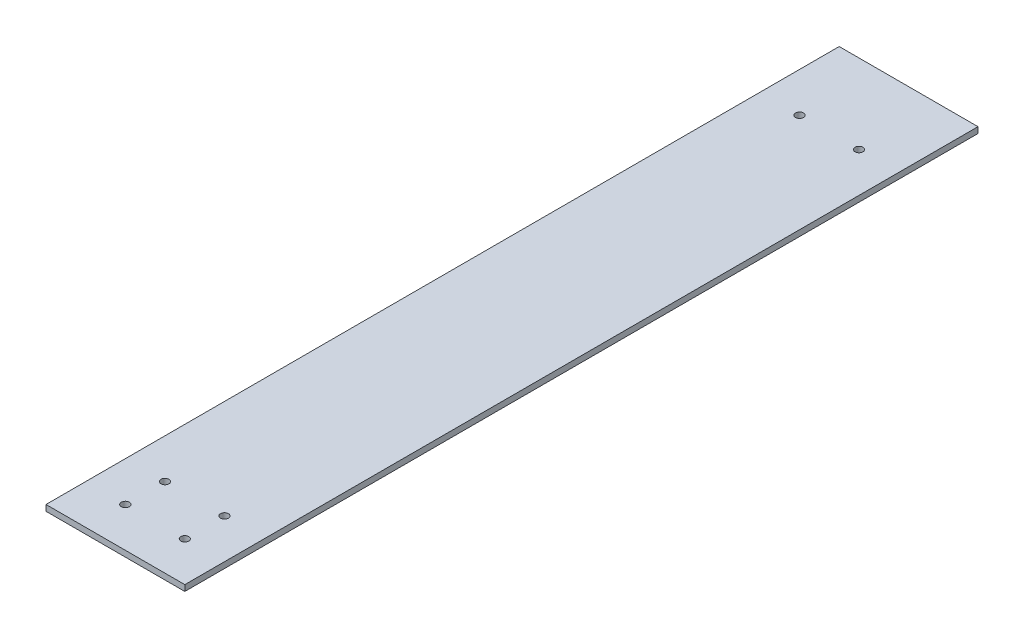
ISO-10303-21;
HEADER;
FILE_DESCRIPTION(('STEP AP214'),'2;1');
FILE_NAME('part.step','',(''),(''),'','','');
FILE_SCHEMA(('AUTOMOTIVE_DESIGN { 1 0 10303 214 1 1 1 1 }'));
ENDSEC;
DATA;
#1=APPLICATION_CONTEXT('core data for automotive mechanical design processes');
#2=APPLICATION_PROTOCOL_DEFINITION('international standard','automotive_design',2000,#1);
#3=PRODUCT_CONTEXT('',#1,'mechanical');
#4=PRODUCT('Part','Part','',(#3));
#5=PRODUCT_RELATED_PRODUCT_CATEGORY('part','',(#4));
#6=PRODUCT_DEFINITION_FORMATION('','',#4);
#7=PRODUCT_DEFINITION_CONTEXT('part definition',#1,'design');
#8=PRODUCT_DEFINITION('design','',#6,#7);
#9=PRODUCT_DEFINITION_SHAPE('','',#8);
#10=(LENGTH_UNIT() NAMED_UNIT(*) SI_UNIT(.MILLI.,.METRE.));
#11=(NAMED_UNIT(*) PLANE_ANGLE_UNIT() SI_UNIT($,.RADIAN.));
#12=(NAMED_UNIT(*) SI_UNIT($,.STERADIAN.) SOLID_ANGLE_UNIT());
#13=UNCERTAINTY_MEASURE_WITH_UNIT(LENGTH_MEASURE(1.E-05),#10,'distance_accuracy_value','');
#14=(GEOMETRIC_REPRESENTATION_CONTEXT(3) GLOBAL_UNCERTAINTY_ASSIGNED_CONTEXT((#13)) GLOBAL_UNIT_ASSIGNED_CONTEXT((#10,
#11,#12)) REPRESENTATION_CONTEXT('',''));
#15=CARTESIAN_POINT('',(0.,0.,0.));
#16=DIRECTION('',(0.,0.,1.));
#17=DIRECTION('',(1.,0.,0.));
#18=AXIS2_PLACEMENT_3D('',#15,#16,#17);
#19=CARTESIAN_POINT('',(-99.0392336314923,3.,-362.936767601911));
#20=DIRECTION('',(0.,0.,1.));
#21=DIRECTION('',(1.,0.,0.));
#22=AXIS2_PLACEMENT_3D('',#19,#20,#21);
#23=PLANE('',#22);
#24=DIRECTION('',(-1.,0.,0.));
#25=VECTOR('',#24,1.);
#26=CARTESIAN_POINT('',(-99.0392336314923,0.,-362.936767601911));
#27=LINE('',#26,#25);
#28=CARTESIAN_POINT('',(-29.0392336314923,0.,-362.936767601911));
#29=VERTEX_POINT('',#28);
#30=CARTESIAN_POINT('',(-99.0392336314923,0.,-362.936767601911));
#31=VERTEX_POINT('',#30);
#32=EDGE_CURVE('E96',#29,#31,#27,.T.);
#33=ORIENTED_EDGE('',*,*,#32,.T.);
#34=DIRECTION('',(0.,-1.,0.));
#35=VECTOR('',#34,1.);
#36=CARTESIAN_POINT('',(-99.0392336314923,3.,-362.936767601911));
#37=LINE('',#36,#35);
#38=CARTESIAN_POINT('',(-99.0392336314923,3.,-362.936767601911));
#39=VERTEX_POINT('',#38);
#40=EDGE_CURVE('E11',#39,#31,#37,.T.);
#41=ORIENTED_EDGE('',*,*,#40,.F.);
#42=DIRECTION('',(-1.,0.,0.));
#43=VECTOR('',#42,1.);
#44=CARTESIAN_POINT('',(-99.0392336314923,3.,-362.936767601911));
#45=LINE('',#44,#43);
#46=CARTESIAN_POINT('',(-29.0392336314923,3.,-362.936767601911));
#47=VERTEX_POINT('',#46);
#48=EDGE_CURVE('E84',#47,#39,#45,.T.);
#49=ORIENTED_EDGE('',*,*,#48,.F.);
#50=DIRECTION('',(0.,-1.,0.));
#51=VECTOR('',#50,1.);
#52=CARTESIAN_POINT('',(-29.0392336314923,3.,-362.936767601911));
#53=LINE('',#52,#51);
#54=EDGE_CURVE('E92',#47,#29,#53,.T.);
#55=ORIENTED_EDGE('',*,*,#54,.T.);
#56=EDGE_LOOP('',(#33,#41,#49,#55));
#57=FACE_BOUND('',#56,.T.);
#58=ADVANCED_FACE('F33',(#57),#23,.F.);
#59=CARTESIAN_POINT('',(-99.0392336314923,3.,-362.936767601911));
#60=DIRECTION('',(1.,0.,0.));
#61=DIRECTION('',(0.,0.,-1.));
#62=AXIS2_PLACEMENT_3D('',#59,#60,#61);
#63=PLANE('',#62);
#64=DIRECTION('',(0.,0.,1.));
#65=VECTOR('',#64,1.);
#66=CARTESIAN_POINT('',(-99.0392336314923,0.,-362.936767601911));
#67=LINE('',#66,#65);
#68=CARTESIAN_POINT('',(-99.0392336314923,0.,37.0632323980888));
#69=VERTEX_POINT('',#68);
#70=EDGE_CURVE('E88',#31,#69,#67,.T.);
#71=ORIENTED_EDGE('',*,*,#70,.T.);
#72=DIRECTION('',(0.,-1.,0.));
#73=VECTOR('',#72,1.);
#74=CARTESIAN_POINT('',(-99.0392336314923,3.,37.0632323980888));
#75=LINE('',#74,#73);
#76=CARTESIAN_POINT('',(-99.0392336314923,3.,37.0632323980888));
#77=VERTEX_POINT('',#76);
#78=EDGE_CURVE('E41',#77,#69,#75,.T.);
#79=ORIENTED_EDGE('',*,*,#78,.F.);
#80=DIRECTION('',(0.,0.,1.));
#81=VECTOR('',#80,1.);
#82=CARTESIAN_POINT('',(-99.0392336314923,3.,-362.936767601911));
#83=LINE('',#82,#81);
#84=EDGE_CURVE('E79',#39,#77,#83,.T.);
#85=ORIENTED_EDGE('',*,*,#84,.F.);
#86=ORIENTED_EDGE('',*,*,#40,.T.);
#87=EDGE_LOOP('',(#71,#79,#85,#86));
#88=FACE_BOUND('',#87,.T.);
#89=ADVANCED_FACE('F87',(#88),#63,.F.);
#90=CARTESIAN_POINT('',(-99.0392336314923,3.,37.0632323980888));
#91=DIRECTION('',(0.,0.,-1.));
#92=DIRECTION('',(-1.,0.,0.));
#93=AXIS2_PLACEMENT_3D('',#90,#91,#92);
#94=PLANE('',#93);
#95=DIRECTION('',(1.,0.,0.));
#96=VECTOR('',#95,1.);
#97=CARTESIAN_POINT('',(-99.0392336314923,0.,37.0632323980888));
#98=LINE('',#97,#96);
#99=CARTESIAN_POINT('',(-29.0392336314922,0.,37.0632323980887));
#100=VERTEX_POINT('',#99);
#101=EDGE_CURVE('E66',#69,#100,#98,.T.);
#102=ORIENTED_EDGE('',*,*,#101,.T.);
#103=DIRECTION('',(0.,-1.,0.));
#104=VECTOR('',#103,1.);
#105=CARTESIAN_POINT('',(-29.0392336314922,3.,37.0632323980887));
#106=LINE('',#105,#104);
#107=CARTESIAN_POINT('',(-29.0392336314922,3.,37.0632323980887));
#108=VERTEX_POINT('',#107);
#109=EDGE_CURVE('E89',#108,#100,#106,.T.);
#110=ORIENTED_EDGE('',*,*,#109,.F.);
#111=DIRECTION('',(1.,0.,0.));
#112=VECTOR('',#111,1.);
#113=CARTESIAN_POINT('',(-99.0392336314923,3.,37.0632323980888));
#114=LINE('',#113,#112);
#115=EDGE_CURVE('E82',#77,#108,#114,.T.);
#116=ORIENTED_EDGE('',*,*,#115,.F.);
#117=ORIENTED_EDGE('',*,*,#78,.T.);
#118=EDGE_LOOP('',(#102,#110,#116,#117));
#119=FACE_BOUND('',#118,.T.);
#120=ADVANCED_FACE('F90',(#119),#94,.F.);
#121=CARTESIAN_POINT('',(-29.0392336314923,3.,-362.936767601911));
#122=DIRECTION('',(-1.,0.,0.));
#123=DIRECTION('',(0.,0.,1.));
#124=AXIS2_PLACEMENT_3D('',#121,#122,#123);
#125=PLANE('',#124);
#126=DIRECTION('',(0.,0.,-1.));
#127=VECTOR('',#126,1.);
#128=CARTESIAN_POINT('',(-29.0392336314923,0.,-362.936767601911));
#129=LINE('',#128,#127);
#130=EDGE_CURVE('E72',#100,#29,#129,.T.);
#131=ORIENTED_EDGE('',*,*,#130,.T.);
#132=ORIENTED_EDGE('',*,*,#54,.F.);
#133=DIRECTION('',(0.,0.,-1.));
#134=VECTOR('',#133,1.);
#135=CARTESIAN_POINT('',(-29.0392336314923,3.,-362.936767601911));
#136=LINE('',#135,#134);
#137=EDGE_CURVE('E49',#108,#47,#136,.T.);
#138=ORIENTED_EDGE('',*,*,#137,.F.);
#139=ORIENTED_EDGE('',*,*,#109,.T.);
#140=EDGE_LOOP('',(#131,#132,#138,#139));
#141=FACE_BOUND('',#140,.T.);
#142=ADVANCED_FACE('F104',(#141),#125,.F.);
#143=CARTESIAN_POINT('',(0.,3.,0.));
#144=DIRECTION('',(0.,-1.,0.));
#145=DIRECTION('',(0.,0.,-1.));
#146=AXIS2_PLACEMENT_3D('',#143,#144,#145);
#147=PLANE('',#146);
#148=CARTESIAN_POINT('',(-79.0392336314923,3.,17.0632323980888));
#149=DIRECTION('',(0.,1.,0.));
#150=DIRECTION('',(0.,0.,1.));
#151=AXIS2_PLACEMENT_3D('',#148,#149,#150);
#152=CIRCLE('',#151,2.);
#153=CARTESIAN_POINT('',(-79.0392336314923,3.,19.0632323980888));
#154=VERTEX_POINT('',#153);
#155=EDGE_CURVE('E128',#154,#154,#152,.T.);
#156=ORIENTED_EDGE('',*,*,#155,.F.);
#157=EDGE_LOOP('',(#156));
#158=FACE_BOUND('',#157,.T.);
#159=CARTESIAN_POINT('',(-49.0392336314923,3.,-2.93676760191124));
#160=DIRECTION('',(0.,1.,0.));
#161=DIRECTION('',(0.,0.,1.));
#162=AXIS2_PLACEMENT_3D('',#159,#160,#161);
#163=CIRCLE('',#162,2.00000000000001);
#164=CARTESIAN_POINT('',(-49.0392336314923,3.,-0.936767601911233));
#165=VERTEX_POINT('',#164);
#166=EDGE_CURVE('E135',#165,#165,#163,.T.);
#167=ORIENTED_EDGE('',*,*,#166,.F.);
#168=EDGE_LOOP('',(#167));
#169=FACE_BOUND('',#168,.T.);
#170=CARTESIAN_POINT('',(-79.0392336314923,3.,-2.93676760191124));
#171=DIRECTION('',(0.,1.,0.));
#172=DIRECTION('',(0.,0.,1.));
#173=AXIS2_PLACEMENT_3D('',#170,#171,#172);
#174=CIRCLE('',#173,2.);
#175=CARTESIAN_POINT('',(-79.0392336314923,3.,-0.936767601911247));
#176=VERTEX_POINT('',#175);
#177=EDGE_CURVE('E116',#176,#176,#174,.T.);
#178=ORIENTED_EDGE('',*,*,#177,.F.);
#179=EDGE_LOOP('',(#178));
#180=FACE_BOUND('',#179,.T.);
#181=CARTESIAN_POINT('',(-49.0392336314923,3.,-322.936767601911));
#182=DIRECTION('',(0.,1.,0.));
#183=DIRECTION('',(0.,0.,1.));
#184=AXIS2_PLACEMENT_3D('',#181,#182,#183);
#185=CIRCLE('',#184,2.);
#186=CARTESIAN_POINT('',(-49.0392336314923,3.,-320.936767601911));
#187=VERTEX_POINT('',#186);
#188=EDGE_CURVE('E123',#187,#187,#185,.T.);
#189=ORIENTED_EDGE('',*,*,#188,.F.);
#190=EDGE_LOOP('',(#189));
#191=FACE_BOUND('',#190,.T.);
#192=CARTESIAN_POINT('',(-49.0392336314923,3.,17.0632323980888));
#193=DIRECTION('',(0.,1.,0.));
#194=DIRECTION('',(0.,0.,1.));
#195=AXIS2_PLACEMENT_3D('',#192,#193,#194);
#196=CIRCLE('',#195,2.00000000000001);
#197=CARTESIAN_POINT('',(-49.0392336314923,3.,19.0632323980888));
#198=VERTEX_POINT('',#197);
#199=EDGE_CURVE('E140',#198,#198,#196,.T.);
#200=ORIENTED_EDGE('',*,*,#199,.F.);
#201=EDGE_LOOP('',(#200));
#202=FACE_BOUND('',#201,.T.);
#203=CARTESIAN_POINT('',(-79.0392336314923,3.,-322.936767601911));
#204=DIRECTION('',(0.,1.,0.));
#205=DIRECTION('',(0.,0.,1.));
#206=AXIS2_PLACEMENT_3D('',#203,#204,#205);
#207=CIRCLE('',#206,2.);
#208=CARTESIAN_POINT('',(-79.0392336314923,3.,-320.936767601911));
#209=VERTEX_POINT('',#208);
#210=EDGE_CURVE('E110',#209,#209,#207,.T.);
#211=ORIENTED_EDGE('',*,*,#210,.F.);
#212=EDGE_LOOP('',(#211));
#213=FACE_BOUND('',#212,.T.);
#214=ORIENTED_EDGE('',*,*,#48,.T.);
#215=ORIENTED_EDGE('',*,*,#84,.T.);
#216=ORIENTED_EDGE('',*,*,#115,.T.);
#217=ORIENTED_EDGE('',*,*,#137,.T.);
#218=EDGE_LOOP('',(#214,#215,#216,#217));
#219=FACE_BOUND('',#218,.T.);
#220=ADVANCED_FACE('F80',(#158,#169,#180,#191,#202,#213,#219),#147,.F.);
#221=CARTESIAN_POINT('',(0.,0.,0.));
#222=DIRECTION('',(0.,-1.,0.));
#223=DIRECTION('',(0.,0.,-1.));
#224=AXIS2_PLACEMENT_3D('',#221,#222,#223);
#225=PLANE('',#224);
#226=CARTESIAN_POINT('',(-79.0392336314923,0.,17.0632323980888));
#227=DIRECTION('',(0.,1.,0.));
#228=DIRECTION('',(0.,0.,1.));
#229=AXIS2_PLACEMENT_3D('',#226,#227,#228);
#230=CIRCLE('',#229,2.);
#231=CARTESIAN_POINT('',(-79.0392336314923,0.,19.0632323980888));
#232=VERTEX_POINT('',#231);
#233=EDGE_CURVE('E131',#232,#232,#230,.T.);
#234=ORIENTED_EDGE('',*,*,#233,.T.);
#235=EDGE_LOOP('',(#234));
#236=FACE_BOUND('',#235,.T.);
#237=CARTESIAN_POINT('',(-49.0392336314923,0.,-2.93676760191124));
#238=DIRECTION('',(0.,1.,0.));
#239=DIRECTION('',(0.,0.,1.));
#240=AXIS2_PLACEMENT_3D('',#237,#238,#239);
#241=CIRCLE('',#240,2.00000000000001);
#242=CARTESIAN_POINT('',(-49.0392336314923,0.,-0.936767601911233));
#243=VERTEX_POINT('',#242);
#244=EDGE_CURVE('E120',#243,#243,#241,.T.);
#245=ORIENTED_EDGE('',*,*,#244,.T.);
#246=EDGE_LOOP('',(#245));
#247=FACE_BOUND('',#246,.T.);
#248=CARTESIAN_POINT('',(-79.0392336314923,0.,-2.93676760191124));
#249=DIRECTION('',(0.,1.,0.));
#250=DIRECTION('',(0.,0.,1.));
#251=AXIS2_PLACEMENT_3D('',#248,#249,#250);
#252=CIRCLE('',#251,2.);
#253=CARTESIAN_POINT('',(-79.0392336314923,0.,-0.936767601911247));
#254=VERTEX_POINT('',#253);
#255=EDGE_CURVE('E119',#254,#254,#252,.T.);
#256=ORIENTED_EDGE('',*,*,#255,.T.);
#257=EDGE_LOOP('',(#256));
#258=FACE_BOUND('',#257,.T.);
#259=CARTESIAN_POINT('',(-49.0392336314923,0.,-322.936767601911));
#260=DIRECTION('',(0.,1.,0.));
#261=DIRECTION('',(0.,0.,1.));
#262=AXIS2_PLACEMENT_3D('',#259,#260,#261);
#263=CIRCLE('',#262,2.);
#264=CARTESIAN_POINT('',(-49.0392336314923,0.,-320.936767601911));
#265=VERTEX_POINT('',#264);
#266=EDGE_CURVE('E113',#265,#265,#263,.T.);
#267=ORIENTED_EDGE('',*,*,#266,.T.);
#268=EDGE_LOOP('',(#267));
#269=FACE_BOUND('',#268,.T.);
#270=CARTESIAN_POINT('',(-49.0392336314923,0.,17.0632323980888));
#271=DIRECTION('',(0.,1.,0.));
#272=DIRECTION('',(0.,0.,1.));
#273=AXIS2_PLACEMENT_3D('',#270,#271,#272);
#274=CIRCLE('',#273,2.00000000000001);
#275=CARTESIAN_POINT('',(-49.0392336314923,0.,19.0632323980888));
#276=VERTEX_POINT('',#275);
#277=EDGE_CURVE('E132',#276,#276,#274,.T.);
#278=ORIENTED_EDGE('',*,*,#277,.T.);
#279=EDGE_LOOP('',(#278));
#280=FACE_BOUND('',#279,.T.);
#281=CARTESIAN_POINT('',(-79.0392336314923,0.,-322.936767601911));
#282=DIRECTION('',(0.,1.,0.));
#283=DIRECTION('',(0.,0.,1.));
#284=AXIS2_PLACEMENT_3D('',#281,#282,#283);
#285=CIRCLE('',#284,2.);
#286=CARTESIAN_POINT('',(-79.0392336314923,0.,-320.936767601911));
#287=VERTEX_POINT('',#286);
#288=EDGE_CURVE('E99',#287,#287,#285,.T.);
#289=ORIENTED_EDGE('',*,*,#288,.T.);
#290=EDGE_LOOP('',(#289));
#291=FACE_BOUND('',#290,.T.);
#292=ORIENTED_EDGE('',*,*,#32,.F.);
#293=ORIENTED_EDGE('',*,*,#130,.F.);
#294=ORIENTED_EDGE('',*,*,#101,.F.);
#295=ORIENTED_EDGE('',*,*,#70,.F.);
#296=EDGE_LOOP('',(#292,#293,#294,#295));
#297=FACE_BOUND('',#296,.T.);
#298=ADVANCED_FACE('F107',(#236,#247,#258,#269,#280,#291,#297),#225,.T.);
#299=CARTESIAN_POINT('',(-79.0392336314923,0.,-322.936767601911));
#300=DIRECTION('',(0.,1.,0.));
#301=DIRECTION('',(0.,0.,1.));
#302=AXIS2_PLACEMENT_3D('',#299,#300,#301);
#303=CYLINDRICAL_SURFACE('',#302,2.);
#304=ORIENTED_EDGE('',*,*,#288,.F.);
#305=EDGE_LOOP('',(#304));
#306=FACE_BOUND('',#305,.T.);
#307=ORIENTED_EDGE('',*,*,#210,.T.);
#308=EDGE_LOOP('',(#307));
#309=FACE_BOUND('',#308,.T.);
#310=ADVANCED_FACE('F152',(#306,#309),#303,.F.);
#311=CARTESIAN_POINT('',(-49.0392336314923,0.,17.0632323980888));
#312=DIRECTION('',(0.,1.,0.));
#313=DIRECTION('',(0.,0.,1.));
#314=AXIS2_PLACEMENT_3D('',#311,#312,#313);
#315=CYLINDRICAL_SURFACE('',#314,2.00000000000001);
#316=ORIENTED_EDGE('',*,*,#277,.F.);
#317=EDGE_LOOP('',(#316));
#318=FACE_BOUND('',#317,.T.);
#319=ORIENTED_EDGE('',*,*,#199,.T.);
#320=EDGE_LOOP('',(#319));
#321=FACE_BOUND('',#320,.T.);
#322=ADVANCED_FACE('F148',(#318,#321),#315,.F.);
#323=CARTESIAN_POINT('',(-49.0392336314923,0.,-322.936767601911));
#324=DIRECTION('',(0.,1.,0.));
#325=DIRECTION('',(0.,0.,1.));
#326=AXIS2_PLACEMENT_3D('',#323,#324,#325);
#327=CYLINDRICAL_SURFACE('',#326,2.);
#328=ORIENTED_EDGE('',*,*,#266,.F.);
#329=EDGE_LOOP('',(#328));
#330=FACE_BOUND('',#329,.T.);
#331=ORIENTED_EDGE('',*,*,#188,.T.);
#332=EDGE_LOOP('',(#331));
#333=FACE_BOUND('',#332,.T.);
#334=ADVANCED_FACE('F151',(#330,#333),#327,.F.);
#335=CARTESIAN_POINT('',(-79.0392336314923,0.,-2.93676760191124));
#336=DIRECTION('',(0.,1.,0.));
#337=DIRECTION('',(0.,0.,1.));
#338=AXIS2_PLACEMENT_3D('',#335,#336,#337);
#339=CYLINDRICAL_SURFACE('',#338,2.);
#340=ORIENTED_EDGE('',*,*,#255,.F.);
#341=EDGE_LOOP('',(#340));
#342=FACE_BOUND('',#341,.T.);
#343=ORIENTED_EDGE('',*,*,#177,.T.);
#344=EDGE_LOOP('',(#343));
#345=FACE_BOUND('',#344,.T.);
#346=ADVANCED_FACE('F213',(#342,#345),#339,.F.);
#347=CARTESIAN_POINT('',(-49.0392336314923,0.,-2.93676760191124));
#348=DIRECTION('',(0.,1.,0.));
#349=DIRECTION('',(0.,0.,1.));
#350=AXIS2_PLACEMENT_3D('',#347,#348,#349);
#351=CYLINDRICAL_SURFACE('',#350,2.00000000000001);
#352=ORIENTED_EDGE('',*,*,#244,.F.);
#353=EDGE_LOOP('',(#352));
#354=FACE_BOUND('',#353,.T.);
#355=ORIENTED_EDGE('',*,*,#166,.T.);
#356=EDGE_LOOP('',(#355));
#357=FACE_BOUND('',#356,.T.);
#358=ADVANCED_FACE('F223',(#354,#357),#351,.F.);
#359=CARTESIAN_POINT('',(-79.0392336314923,0.,17.0632323980888));
#360=DIRECTION('',(0.,1.,0.));
#361=DIRECTION('',(0.,0.,1.));
#362=AXIS2_PLACEMENT_3D('',#359,#360,#361);
#363=CYLINDRICAL_SURFACE('',#362,2.);
#364=ORIENTED_EDGE('',*,*,#233,.F.);
#365=EDGE_LOOP('',(#364));
#366=FACE_BOUND('',#365,.T.);
#367=ORIENTED_EDGE('',*,*,#155,.T.);
#368=EDGE_LOOP('',(#367));
#369=FACE_BOUND('',#368,.T.);
#370=ADVANCED_FACE('F232',(#366,#369),#363,.F.);
#371=CLOSED_SHELL('',(#58,#89,#120,#142,#220,#298,#310,#322,#334,#346,#358,#370));
#372=MANIFOLD_SOLID_BREP('B2',#371);
#373=ADVANCED_BREP_SHAPE_REPRESENTATION('',(#18,#372),#14);
#374=SHAPE_DEFINITION_REPRESENTATION(#9,#373);
ENDSEC;
END-ISO-10303-21;
